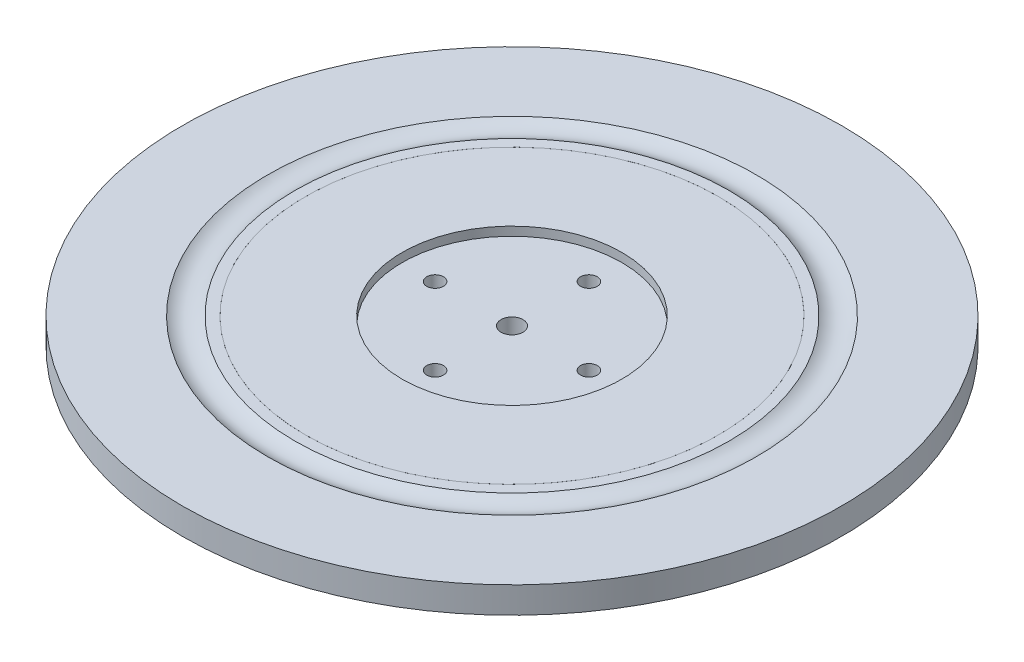
ISO-10303-21;
HEADER;
FILE_DESCRIPTION(('STEP AP214'),'2;1');
FILE_NAME('part.step','',(''),(''),'','','');
FILE_SCHEMA(('AUTOMOTIVE_DESIGN { 1 0 10303 214 1 1 1 1 }'));
ENDSEC;
DATA;
#1=APPLICATION_CONTEXT('core data for automotive mechanical design processes');
#2=APPLICATION_PROTOCOL_DEFINITION('international standard','automotive_design',2000,#1);
#3=PRODUCT_CONTEXT('',#1,'mechanical');
#4=PRODUCT('Part','Part','',(#3));
#5=PRODUCT_RELATED_PRODUCT_CATEGORY('part','',(#4));
#6=PRODUCT_DEFINITION_FORMATION('','',#4);
#7=PRODUCT_DEFINITION_CONTEXT('part definition',#1,'design');
#8=PRODUCT_DEFINITION('design','',#6,#7);
#9=PRODUCT_DEFINITION_SHAPE('','',#8);
#10=(LENGTH_UNIT() NAMED_UNIT(*) SI_UNIT(.MILLI.,.METRE.));
#11=(NAMED_UNIT(*) PLANE_ANGLE_UNIT() SI_UNIT($,.RADIAN.));
#12=(NAMED_UNIT(*) SI_UNIT($,.STERADIAN.) SOLID_ANGLE_UNIT());
#13=UNCERTAINTY_MEASURE_WITH_UNIT(LENGTH_MEASURE(1.E-05),#10,'distance_accuracy_value','');
#14=(GEOMETRIC_REPRESENTATION_CONTEXT(3) GLOBAL_UNCERTAINTY_ASSIGNED_CONTEXT((#13)) GLOBAL_UNIT_ASSIGNED_CONTEXT((#10,
#11,#12)) REPRESENTATION_CONTEXT('',''));
#15=CARTESIAN_POINT('',(0.,0.,0.));
#16=DIRECTION('',(0.,0.,1.));
#17=DIRECTION('',(1.,0.,0.));
#18=AXIS2_PLACEMENT_3D('',#15,#16,#17);
#19=CARTESIAN_POINT('',(0.,8.8724,0.));
#20=DIRECTION('',(0.,-1.,0.));
#21=DIRECTION('',(0.,0.,-1.));
#22=AXIS2_PLACEMENT_3D('',#19,#20,#21);
#23=CYLINDRICAL_SURFACE('',#22,2.5);
#24=CARTESIAN_POINT('',(0.,0.8724,0.));
#25=DIRECTION('',(0.,-1.,0.));
#26=DIRECTION('',(0.,0.,-1.));
#27=AXIS2_PLACEMENT_3D('',#24,#25,#26);
#28=CIRCLE('',#27,2.5);
#29=CARTESIAN_POINT('',(0.,0.8724,-2.5));
#30=VERTEX_POINT('',#29);
#31=EDGE_CURVE('E295',#30,#30,#28,.T.);
#32=ORIENTED_EDGE('',*,*,#31,.T.);
#33=EDGE_LOOP('',(#32));
#34=FACE_BOUND('',#33,.T.);
#35=CARTESIAN_POINT('',(0.,4.8724,0.));
#36=DIRECTION('',(0.,1.,0.));
#37=DIRECTION('',(0.,0.,1.));
#38=AXIS2_PLACEMENT_3D('',#35,#36,#37);
#39=CIRCLE('',#38,2.5);
#40=CARTESIAN_POINT('',(0.,4.8724,2.5));
#41=VERTEX_POINT('',#40);
#42=EDGE_CURVE('E290',#41,#41,#39,.F.);
#43=ORIENTED_EDGE('',*,*,#42,.F.);
#44=EDGE_LOOP('',(#43));
#45=FACE_BOUND('',#44,.T.);
#46=ADVANCED_FACE('F41',(#34,#45),#23,.F.);
#47=CARTESIAN_POINT('',(-17.4999999999995,8.8724,-4.96308349082817E-13));
#48=DIRECTION('',(0.,-1.,0.));
#49=DIRECTION('',(0.,0.,-1.));
#50=AXIS2_PLACEMENT_3D('',#47,#48,#49);
#51=CYLINDRICAL_SURFACE('',#50,1.90000000000079);
#52=CARTESIAN_POINT('',(-17.4999999999995,0.8724,-4.96308349082817E-13));
#53=DIRECTION('',(0.,-1.,0.));
#54=DIRECTION('',(0.,0.,-1.));
#55=AXIS2_PLACEMENT_3D('',#52,#53,#54);
#56=CIRCLE('',#55,1.90000000000079);
#57=CARTESIAN_POINT('',(-17.4999999999995,0.8724,-1.90000000000129));
#58=VERTEX_POINT('',#57);
#59=EDGE_CURVE('E293',#58,#58,#56,.T.);
#60=ORIENTED_EDGE('',*,*,#59,.T.);
#61=EDGE_LOOP('',(#60));
#62=FACE_BOUND('',#61,.T.);
#63=CARTESIAN_POINT('',(-17.4999999999995,4.8724,-4.96308349082817E-13));
#64=DIRECTION('',(0.,1.,0.));
#65=DIRECTION('',(0.,0.,1.));
#66=AXIS2_PLACEMENT_3D('',#63,#64,#65);
#67=CIRCLE('',#66,1.90000000000079);
#68=CARTESIAN_POINT('',(-17.4999999999995,4.8724,1.9000000000003));
#69=VERTEX_POINT('',#68);
#70=EDGE_CURVE('E287',#69,#69,#67,.F.);
#71=ORIENTED_EDGE('',*,*,#70,.F.);
#72=EDGE_LOOP('',(#71));
#73=FACE_BOUND('',#72,.T.);
#74=ADVANCED_FACE('F93',(#62,#73),#51,.F.);
#75=CARTESIAN_POINT('',(9.88330434368618E-13,8.8724,-17.5));
#76=DIRECTION('',(0.,-1.,0.));
#77=DIRECTION('',(0.,0.,-1.));
#78=AXIS2_PLACEMENT_3D('',#75,#76,#77);
#79=CYLINDRICAL_SURFACE('',#78,1.90000000000106);
#80=CARTESIAN_POINT('',(9.88330434368618E-13,0.8724,-17.5));
#81=DIRECTION('',(0.,-1.,0.));
#82=DIRECTION('',(0.,0.,-1.));
#83=AXIS2_PLACEMENT_3D('',#80,#81,#82);
#84=CIRCLE('',#83,1.90000000000106);
#85=CARTESIAN_POINT('',(9.88330434368618E-13,0.8724,-19.4000000000011));
#86=VERTEX_POINT('',#85);
#87=EDGE_CURVE('E299',#86,#86,#84,.T.);
#88=ORIENTED_EDGE('',*,*,#87,.T.);
#89=EDGE_LOOP('',(#88));
#90=FACE_BOUND('',#89,.T.);
#91=CARTESIAN_POINT('',(9.88330434368618E-13,4.8724,-17.5));
#92=DIRECTION('',(0.,1.,0.));
#93=DIRECTION('',(0.,0.,1.));
#94=AXIS2_PLACEMENT_3D('',#91,#92,#93);
#95=CIRCLE('',#94,1.90000000000106);
#96=CARTESIAN_POINT('',(9.88330434368618E-13,4.8724,-15.599999999999));
#97=VERTEX_POINT('',#96);
#98=EDGE_CURVE('E276',#97,#97,#95,.F.);
#99=ORIENTED_EDGE('',*,*,#98,.F.);
#100=EDGE_LOOP('',(#99));
#101=FACE_BOUND('',#100,.T.);
#102=ADVANCED_FACE('F99',(#90,#101),#79,.F.);
#103=CARTESIAN_POINT('',(17.5000000000005,8.8724,4.94165217184309E-13));
#104=DIRECTION('',(0.,-1.,0.));
#105=DIRECTION('',(0.,0.,-1.));
#106=AXIS2_PLACEMENT_3D('',#103,#104,#105);
#107=CYLINDRICAL_SURFACE('',#106,1.90000000000039);
#108=CARTESIAN_POINT('',(17.5000000000005,0.8724,4.94165217184309E-13));
#109=DIRECTION('',(0.,-1.,0.));
#110=DIRECTION('',(0.,0.,-1.));
#111=AXIS2_PLACEMENT_3D('',#108,#109,#110);
#112=CIRCLE('',#111,1.90000000000039);
#113=CARTESIAN_POINT('',(17.5000000000005,0.8724,-1.89999999999989));
#114=VERTEX_POINT('',#113);
#115=EDGE_CURVE('E296',#114,#114,#112,.T.);
#116=ORIENTED_EDGE('',*,*,#115,.T.);
#117=EDGE_LOOP('',(#116));
#118=FACE_BOUND('',#117,.T.);
#119=CARTESIAN_POINT('',(17.5000000000005,4.8724,4.94165217184309E-13));
#120=DIRECTION('',(0.,1.,0.));
#121=DIRECTION('',(0.,0.,1.));
#122=AXIS2_PLACEMENT_3D('',#119,#120,#121);
#123=CIRCLE('',#122,1.90000000000039);
#124=CARTESIAN_POINT('',(17.5000000000005,4.8724,1.90000000000088));
#125=VERTEX_POINT('',#124);
#126=EDGE_CURVE('E273',#125,#125,#123,.F.);
#127=ORIENTED_EDGE('',*,*,#126,.F.);
#128=EDGE_LOOP('',(#127));
#129=FACE_BOUND('',#128,.T.);
#130=ADVANCED_FACE('F210',(#118,#129),#107,.F.);
#131=CARTESIAN_POINT('',(0.,8.8724,17.5));
#132=DIRECTION('',(0.,-1.,0.));
#133=DIRECTION('',(0.,0.,-1.));
#134=AXIS2_PLACEMENT_3D('',#131,#132,#133);
#135=CYLINDRICAL_SURFACE('',#134,1.9);
#136=CARTESIAN_POINT('',(0.,0.8724,17.5));
#137=DIRECTION('',(0.,-1.,0.));
#138=DIRECTION('',(0.,0.,-1.));
#139=AXIS2_PLACEMENT_3D('',#136,#137,#138);
#140=CIRCLE('',#139,1.9);
#141=CARTESIAN_POINT('',(0.,0.8724,15.6));
#142=VERTEX_POINT('',#141);
#143=EDGE_CURVE('E269',#142,#142,#140,.T.);
#144=ORIENTED_EDGE('',*,*,#143,.T.);
#145=EDGE_LOOP('',(#144));
#146=FACE_BOUND('',#145,.T.);
#147=CARTESIAN_POINT('',(0.,4.8724,17.5));
#148=DIRECTION('',(0.,1.,0.));
#149=DIRECTION('',(0.,0.,1.));
#150=AXIS2_PLACEMENT_3D('',#147,#148,#149);
#151=CIRCLE('',#150,1.9);
#152=CARTESIAN_POINT('',(0.,4.8724,19.4));
#153=VERTEX_POINT('',#152);
#154=EDGE_CURVE('E45',#153,#153,#151,.F.);
#155=ORIENTED_EDGE('',*,*,#154,.F.);
#156=EDGE_LOOP('',(#155));
#157=FACE_BOUND('',#156,.T.);
#158=ADVANCED_FACE('F91',(#146,#157),#135,.F.);
#159=CARTESIAN_POINT('',(59.,0.8724,0.));
#160=DIRECTION('',(0.,-1.,0.));
#161=DIRECTION('',(0.,0.,-1.));
#162=AXIS2_PLACEMENT_3D('',#159,#160,#161);
#163=PLANE('',#162);
#164=CARTESIAN_POINT('',(0.,0.8724,0.));
#165=DIRECTION('',(0.,1.,0.));
#166=DIRECTION('',(0.,0.,1.));
#167=AXIS2_PLACEMENT_3D('',#164,#165,#166);
#168=CIRCLE('',#167,47.);
#169=CARTESIAN_POINT('',(0.,0.8724,47.));
#170=VERTEX_POINT('',#169);
#171=EDGE_CURVE('E54',#170,#170,#168,.T.);
#172=ORIENTED_EDGE('',*,*,#171,.T.);
#173=EDGE_LOOP('',(#172));
#174=FACE_BOUND('',#173,.T.);
#175=CARTESIAN_POINT('',(0.,0.8724,0.));
#176=DIRECTION('',(0.,-1.,0.));
#177=DIRECTION('',(0.,0.,-1.));
#178=AXIS2_PLACEMENT_3D('',#175,#176,#177);
#179=CIRCLE('',#178,75.);
#180=CARTESIAN_POINT('',(0.,0.8724,-75.));
#181=VERTEX_POINT('',#180);
#182=EDGE_CURVE('E63',#181,#181,#179,.T.);
#183=ORIENTED_EDGE('',*,*,#182,.T.);
#184=EDGE_LOOP('',(#183));
#185=FACE_BOUND('',#184,.T.);
#186=ADVANCED_FACE('F43',(#174,#185),#163,.T.);
#187=CARTESIAN_POINT('',(0.,1.8724,0.));
#188=DIRECTION('',(0.,1.,0.));
#189=DIRECTION('',(0.,0.,1.));
#190=AXIS2_PLACEMENT_3D('',#187,#188,#189);
#191=TOROIDAL_SURFACE('',#190,47.,1.);
#192=CARTESIAN_POINT('',(0.,0.872424878980681,0.));
#193=DIRECTION('',(0.,1.,0.));
#194=DIRECTION('',(0.,0.,1.));
#195=AXIS2_PLACEMENT_3D('',#192,#193,#194);
#196=CIRCLE('',#195,46.9929461115406);
#197=CARTESIAN_POINT('',(0.,0.872424878980681,46.9929461115406));
#198=VERTEX_POINT('',#197);
#199=EDGE_CURVE('E11',#198,#198,#196,.F.);
#200=ORIENTED_EDGE('',*,*,#199,.F.);
#201=EDGE_LOOP('',(#200));
#202=FACE_BOUND('',#201,.T.);
#203=ORIENTED_EDGE('',*,*,#171,.F.);
#204=EDGE_LOOP('',(#203));
#205=FACE_BOUND('',#204,.T.);
#206=ADVANCED_FACE('F80',(#202,#205),#191,.T.);
#207=CARTESIAN_POINT('',(0.,5.8724,0.));
#208=DIRECTION('',(0.,1.,0.));
#209=DIRECTION('',(0.,0.,1.));
#210=AXIS2_PLACEMENT_3D('',#207,#208,#209);
#211=CONICAL_SURFACE('',#210,46.,0.785398163397353);
#212=CARTESIAN_POINT('',(0.,6.86534611154079,0.));
#213=DIRECTION('',(0.,1.,0.));
#214=DIRECTION('',(0.,0.,1.));
#215=AXIS2_PLACEMENT_3D('',#212,#213,#214);
#216=CIRCLE('',#215,46.9929461115406);
#217=CARTESIAN_POINT('',(0.,6.86534611154079,46.9929461115406));
#218=VERTEX_POINT('',#217);
#219=EDGE_CURVE('E49',#218,#218,#216,.T.);
#220=ORIENTED_EDGE('',*,*,#219,.F.);
#221=EDGE_LOOP('',(#220));
#222=FACE_BOUND('',#221,.T.);
#223=CARTESIAN_POINT('',(0.,6.87240000000019,0.));
#224=DIRECTION('',(0.,1.,0.));
#225=DIRECTION('',(0.,0.,1.));
#226=AXIS2_PLACEMENT_3D('',#223,#224,#225);
#227=CIRCLE('',#226,47.);
#228=CARTESIAN_POINT('',(0.,6.87240000000019,47.));
#229=VERTEX_POINT('',#228);
#230=EDGE_CURVE('E72',#229,#229,#227,.T.);
#231=ORIENTED_EDGE('',*,*,#230,.T.);
#232=EDGE_LOOP('',(#231));
#233=FACE_BOUND('',#232,.T.);
#234=ADVANCED_FACE('F82',(#222,#233),#211,.F.);
#235=CARTESIAN_POINT('',(47.,6.87240000000009,0.));
#236=DIRECTION('',(0.,1.,0.));
#237=DIRECTION('',(0.,0.,1.));
#238=AXIS2_PLACEMENT_3D('',#235,#236,#237);
#239=PLANE('',#238);
#240=CARTESIAN_POINT('',(0.,6.8724,0.));
#241=DIRECTION('',(0.,1.,0.));
#242=DIRECTION('',(0.,0.,1.));
#243=AXIS2_PLACEMENT_3D('',#240,#241,#242);
#244=CIRCLE('',#243,49.4043);
#245=CARTESIAN_POINT('',(0.,6.8724,49.4043));
#246=VERTEX_POINT('',#245);
#247=EDGE_CURVE('E69',#246,#246,#244,.T.);
#248=ORIENTED_EDGE('',*,*,#247,.T.);
#249=EDGE_LOOP('',(#248));
#250=FACE_BOUND('',#249,.T.);
#251=ORIENTED_EDGE('',*,*,#230,.F.);
#252=EDGE_LOOP('',(#251));
#253=FACE_BOUND('',#252,.T.);
#254=ADVANCED_FACE('F88',(#250,#253),#239,.T.);
#255=CARTESIAN_POINT('',(0.,11.,0.));
#256=DIRECTION('',(0.,1.,0.));
#257=DIRECTION('',(0.,0.,1.));
#258=AXIS2_PLACEMENT_3D('',#255,#256,#257);
#259=TOROIDAL_SURFACE('',#258,52.5,5.15950000000006);
#260=CARTESIAN_POINT('',(0.,6.87239999999989,0.));
#261=DIRECTION('',(0.,1.,0.));
#262=DIRECTION('',(0.,0.,1.));
#263=AXIS2_PLACEMENT_3D('',#260,#261,#262);
#264=CIRCLE('',#263,55.5957);
#265=CARTESIAN_POINT('',(0.,6.87239999999989,55.5957));
#266=VERTEX_POINT('',#265);
#267=EDGE_CURVE('E62',#266,#266,#264,.T.);
#268=ORIENTED_EDGE('',*,*,#267,.T.);
#269=EDGE_LOOP('',(#268));
#270=FACE_BOUND('',#269,.T.);
#271=ORIENTED_EDGE('',*,*,#247,.F.);
#272=EDGE_LOOP('',(#271));
#273=FACE_BOUND('',#272,.T.);
#274=ADVANCED_FACE('F127',(#270,#273),#259,.F.);
#275=CARTESIAN_POINT('',(55.5957,6.87239999999995,0.));
#276=DIRECTION('',(0.,1.,0.));
#277=DIRECTION('',(0.,0.,1.));
#278=AXIS2_PLACEMENT_3D('',#275,#276,#277);
#279=PLANE('',#278);
#280=ORIENTED_EDGE('',*,*,#267,.F.);
#281=EDGE_LOOP('',(#280));
#282=FACE_BOUND('',#281,.T.);
#283=CARTESIAN_POINT('',(0.,6.8724,0.));
#284=DIRECTION('',(0.,-1.,0.));
#285=DIRECTION('',(0.,0.,-1.));
#286=AXIS2_PLACEMENT_3D('',#283,#284,#285);
#287=CIRCLE('',#286,75.);
#288=CARTESIAN_POINT('',(0.,6.8724,-75.));
#289=VERTEX_POINT('',#288);
#290=EDGE_CURVE('E59',#289,#289,#287,.T.);
#291=ORIENTED_EDGE('',*,*,#290,.F.);
#292=EDGE_LOOP('',(#291));
#293=FACE_BOUND('',#292,.T.);
#294=ADVANCED_FACE('F123',(#282,#293),#279,.T.);
#295=CARTESIAN_POINT('',(0.,6.8724,0.));
#296=DIRECTION('',(0.,-1.,0.));
#297=DIRECTION('',(0.,0.,-1.));
#298=AXIS2_PLACEMENT_3D('',#295,#296,#297);
#299=CYLINDRICAL_SURFACE('',#298,75.);
#300=ORIENTED_EDGE('',*,*,#290,.T.);
#301=EDGE_LOOP('',(#300));
#302=FACE_BOUND('',#301,.T.);
#303=ORIENTED_EDGE('',*,*,#182,.F.);
#304=EDGE_LOOP('',(#303));
#305=FACE_BOUND('',#304,.T.);
#306=ADVANCED_FACE('F110',(#302,#305),#299,.T.);
#307=CARTESIAN_POINT('',(0.,6.8724,0.));
#308=DIRECTION('',(0.,-1.,0.));
#309=DIRECTION('',(0.,0.,-1.));
#310=AXIS2_PLACEMENT_3D('',#307,#308,#309);
#311=PLANE('',#310);
#312=CARTESIAN_POINT('',(0.,6.8724,0.));
#313=DIRECTION('',(0.,1.,0.));
#314=DIRECTION('',(0.,0.,1.));
#315=AXIS2_PLACEMENT_3D('',#312,#313,#314);
#316=CIRCLE('',#315,25.);
#317=CARTESIAN_POINT('',(0.,6.8724,25.));
#318=VERTEX_POINT('',#317);
#319=EDGE_CURVE('E279',#318,#318,#316,.T.);
#320=ORIENTED_EDGE('',*,*,#319,.F.);
#321=EDGE_LOOP('',(#320));
#322=FACE_BOUND('',#321,.T.);
#323=CARTESIAN_POINT('',(0.,6.8724,0.));
#324=DIRECTION('',(0.,-1.,0.));
#325=DIRECTION('',(0.,0.,-1.));
#326=AXIS2_PLACEMENT_3D('',#323,#324,#325);
#327=CIRCLE('',#326,46.9929461115406);
#328=CARTESIAN_POINT('',(0.,6.8724,-46.9929461115406));
#329=VERTEX_POINT('',#328);
#330=EDGE_CURVE('E66',#329,#329,#327,.T.);
#331=ORIENTED_EDGE('',*,*,#330,.F.);
#332=EDGE_LOOP('',(#331));
#333=FACE_BOUND('',#332,.T.);
#334=ADVANCED_FACE('F106',(#322,#333),#311,.F.);
#335=CARTESIAN_POINT('',(0.,6.8724,0.));
#336=DIRECTION('',(0.,-1.,0.));
#337=DIRECTION('',(0.,0.,-1.));
#338=AXIS2_PLACEMENT_3D('',#335,#336,#337);
#339=CYLINDRICAL_SURFACE('',#338,46.9929461115406);
#340=ORIENTED_EDGE('',*,*,#219,.T.);
#341=EDGE_LOOP('',(#340));
#342=FACE_BOUND('',#341,.T.);
#343=ORIENTED_EDGE('',*,*,#330,.T.);
#344=EDGE_LOOP('',(#343));
#345=FACE_BOUND('',#344,.T.);
#346=ADVANCED_FACE('F109',(#342,#345),#339,.T.);
#347=ORIENTED_EDGE('',*,*,#199,.T.);
#348=EDGE_LOOP('',(#347));
#349=FACE_BOUND('',#348,.T.);
#350=CARTESIAN_POINT('',(0.,0.8724,0.));
#351=DIRECTION('',(0.,-1.,0.));
#352=DIRECTION('',(0.,0.,-1.));
#353=AXIS2_PLACEMENT_3D('',#350,#351,#352);
#354=CIRCLE('',#353,46.9929461115406);
#355=CARTESIAN_POINT('',(0.,0.8724,-46.9929461115406));
#356=VERTEX_POINT('',#355);
#357=EDGE_CURVE('E57',#356,#356,#354,.T.);
#358=ORIENTED_EDGE('',*,*,#357,.F.);
#359=EDGE_LOOP('',(#358));
#360=FACE_BOUND('',#359,.T.);
#361=ADVANCED_FACE('F116',(#349,#360),#339,.T.);
#362=CARTESIAN_POINT('',(0.,0.8724,0.));
#363=DIRECTION('',(0.,-1.,0.));
#364=DIRECTION('',(0.,0.,-1.));
#365=AXIS2_PLACEMENT_3D('',#362,#363,#364);
#366=PLANE('',#365);
#367=ORIENTED_EDGE('',*,*,#143,.F.);
#368=EDGE_LOOP('',(#367));
#369=FACE_BOUND('',#368,.T.);
#370=ORIENTED_EDGE('',*,*,#115,.F.);
#371=EDGE_LOOP('',(#370));
#372=FACE_BOUND('',#371,.T.);
#373=ORIENTED_EDGE('',*,*,#87,.F.);
#374=EDGE_LOOP('',(#373));
#375=FACE_BOUND('',#374,.T.);
#376=ORIENTED_EDGE('',*,*,#59,.F.);
#377=EDGE_LOOP('',(#376));
#378=FACE_BOUND('',#377,.T.);
#379=ORIENTED_EDGE('',*,*,#31,.F.);
#380=EDGE_LOOP('',(#379));
#381=FACE_BOUND('',#380,.T.);
#382=ORIENTED_EDGE('',*,*,#357,.T.);
#383=EDGE_LOOP('',(#382));
#384=FACE_BOUND('',#383,.T.);
#385=ADVANCED_FACE('F112',(#369,#372,#375,#378,#381,#384),#366,.T.);
#386=CARTESIAN_POINT('',(0.,4.8724,0.));
#387=DIRECTION('',(0.,1.,0.));
#388=DIRECTION('',(0.,0.,1.));
#389=AXIS2_PLACEMENT_3D('',#386,#387,#388);
#390=PLANE('',#389);
#391=CARTESIAN_POINT('',(0.,4.8724,0.));
#392=DIRECTION('',(0.,1.,0.));
#393=DIRECTION('',(0.,0.,1.));
#394=AXIS2_PLACEMENT_3D('',#391,#392,#393);
#395=CIRCLE('',#394,25.);
#396=CARTESIAN_POINT('',(0.,4.8724,25.));
#397=VERTEX_POINT('',#396);
#398=EDGE_CURVE('E274',#397,#397,#395,.T.);
#399=ORIENTED_EDGE('',*,*,#398,.T.);
#400=EDGE_LOOP('',(#399));
#401=FACE_BOUND('',#400,.T.);
#402=ORIENTED_EDGE('',*,*,#154,.T.);
#403=EDGE_LOOP('',(#402));
#404=FACE_BOUND('',#403,.T.);
#405=ORIENTED_EDGE('',*,*,#126,.T.);
#406=EDGE_LOOP('',(#405));
#407=FACE_BOUND('',#406,.T.);
#408=ORIENTED_EDGE('',*,*,#98,.T.);
#409=EDGE_LOOP('',(#408));
#410=FACE_BOUND('',#409,.T.);
#411=ORIENTED_EDGE('',*,*,#70,.T.);
#412=EDGE_LOOP('',(#411));
#413=FACE_BOUND('',#412,.T.);
#414=ORIENTED_EDGE('',*,*,#42,.T.);
#415=EDGE_LOOP('',(#414));
#416=FACE_BOUND('',#415,.T.);
#417=ADVANCED_FACE('F115',(#401,#404,#407,#410,#413,#416),#390,.T.);
#418=CARTESIAN_POINT('',(0.,4.8724,0.));
#419=DIRECTION('',(0.,1.,0.));
#420=DIRECTION('',(0.,0.,1.));
#421=AXIS2_PLACEMENT_3D('',#418,#419,#420);
#422=CYLINDRICAL_SURFACE('',#421,25.);
#423=ORIENTED_EDGE('',*,*,#398,.F.);
#424=EDGE_LOOP('',(#423));
#425=FACE_BOUND('',#424,.T.);
#426=ORIENTED_EDGE('',*,*,#319,.T.);
#427=EDGE_LOOP('',(#426));
#428=FACE_BOUND('',#427,.T.);
#429=ADVANCED_FACE('F180',(#425,#428),#422,.F.);
#430=CLOSED_SHELL('',(#46,#74,#102,#130,#158,#186,#206,#234,#254,#274,#294,#306,#334,#346,#361,
#385,#417,#429));
#431=MANIFOLD_SOLID_BREP('B2',#430);
#432=ADVANCED_BREP_SHAPE_REPRESENTATION('',(#18,#431),#14);
#433=SHAPE_DEFINITION_REPRESENTATION(#9,#432);
ENDSEC;
END-ISO-10303-21;
